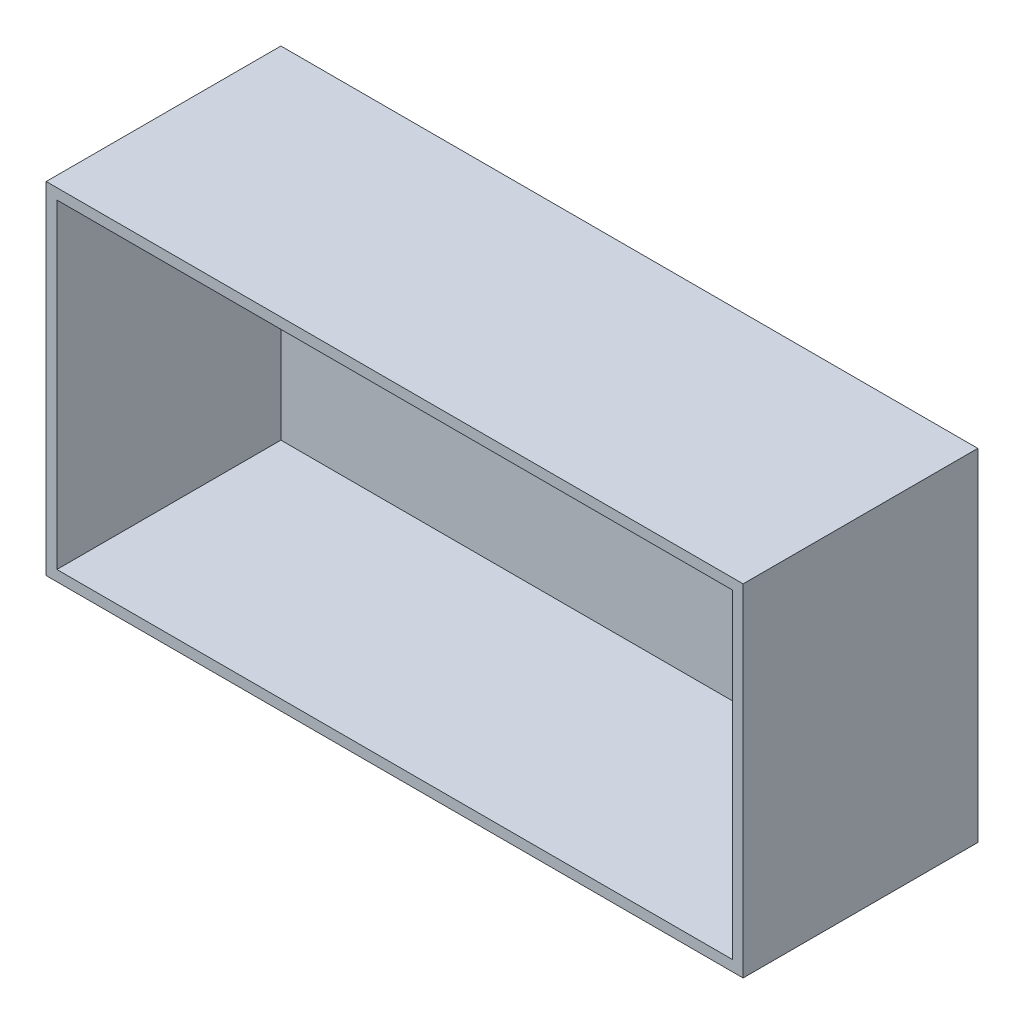
ISO-10303-21;
HEADER;
FILE_DESCRIPTION(('STEP AP214'),'2;1');
FILE_NAME('part.step','',(''),(''),'','','');
FILE_SCHEMA(('AUTOMOTIVE_DESIGN { 1 0 10303 214 1 1 1 1 }'));
ENDSEC;
DATA;
#1=APPLICATION_CONTEXT('core data for automotive mechanical design processes');
#2=APPLICATION_PROTOCOL_DEFINITION('international standard','automotive_design',2000,#1);
#3=PRODUCT_CONTEXT('',#1,'mechanical');
#4=PRODUCT('Part','Part','',(#3));
#5=PRODUCT_RELATED_PRODUCT_CATEGORY('part','',(#4));
#6=PRODUCT_DEFINITION_FORMATION('','',#4);
#7=PRODUCT_DEFINITION_CONTEXT('part definition',#1,'design');
#8=PRODUCT_DEFINITION('design','',#6,#7);
#9=PRODUCT_DEFINITION_SHAPE('','',#8);
#10=(LENGTH_UNIT() NAMED_UNIT(*) SI_UNIT(.MILLI.,.METRE.));
#11=(NAMED_UNIT(*) PLANE_ANGLE_UNIT() SI_UNIT($,.RADIAN.));
#12=(NAMED_UNIT(*) SI_UNIT($,.STERADIAN.) SOLID_ANGLE_UNIT());
#13=UNCERTAINTY_MEASURE_WITH_UNIT(LENGTH_MEASURE(1.E-05),#10,'distance_accuracy_value','');
#14=(GEOMETRIC_REPRESENTATION_CONTEXT(3) GLOBAL_UNCERTAINTY_ASSIGNED_CONTEXT((#13)) GLOBAL_UNIT_ASSIGNED_CONTEXT((#10,
#11,#12)) REPRESENTATION_CONTEXT('',''));
#15=CARTESIAN_POINT('',(0.,0.,0.));
#16=DIRECTION('',(0.,0.,1.));
#17=DIRECTION('',(1.,0.,0.));
#18=AXIS2_PLACEMENT_3D('',#15,#16,#17);
#19=CARTESIAN_POINT('',(0.,0.,66.));
#20=DIRECTION('',(0.,0.,-1.));
#21=DIRECTION('',(-1.,0.,0.));
#22=AXIS2_PLACEMENT_3D('',#19,#20,#21);
#23=PLANE('',#22);
#24=DIRECTION('',(0.,-1.,0.));
#25=VECTOR('',#24,1.);
#26=CARTESIAN_POINT('',(0.,0.,66.));
#27=LINE('',#26,#25);
#28=CARTESIAN_POINT('',(0.,96.,66.));
#29=VERTEX_POINT('',#28);
#30=CARTESIAN_POINT('',(0.,0.,66.));
#31=VERTEX_POINT('',#30);
#32=EDGE_CURVE('E141',#29,#31,#27,.T.);
#33=ORIENTED_EDGE('',*,*,#32,.T.);
#34=DIRECTION('',(1.,0.,0.));
#35=VECTOR('',#34,1.);
#36=CARTESIAN_POINT('',(0.,0.,66.));
#37=LINE('',#36,#35);
#38=CARTESIAN_POINT('',(196.,0.,66.));
#39=VERTEX_POINT('',#38);
#40=EDGE_CURVE('E143',#31,#39,#37,.T.);
#41=ORIENTED_EDGE('',*,*,#40,.T.);
#42=DIRECTION('',(0.,1.,0.));
#43=VECTOR('',#42,1.);
#44=CARTESIAN_POINT('',(196.,0.,66.));
#45=LINE('',#44,#43);
#46=CARTESIAN_POINT('',(196.,96.,66.));
#47=VERTEX_POINT('',#46);
#48=EDGE_CURVE('E150',#39,#47,#45,.T.);
#49=ORIENTED_EDGE('',*,*,#48,.T.);
#50=DIRECTION('',(-1.,0.,0.));
#51=VECTOR('',#50,1.);
#52=CARTESIAN_POINT('',(0.,96.,66.));
#53=LINE('',#52,#51);
#54=EDGE_CURVE('E146',#47,#29,#53,.T.);
#55=ORIENTED_EDGE('',*,*,#54,.T.);
#56=EDGE_LOOP('',(#33,#41,#49,#55));
#57=FACE_BOUND('',#56,.T.);
#58=DIRECTION('',(0.,-1.,0.));
#59=VECTOR('',#58,1.);
#60=CARTESIAN_POINT('',(3.,3.,66.));
#61=LINE('',#60,#59);
#62=CARTESIAN_POINT('',(3.,93.,66.));
#63=VERTEX_POINT('',#62);
#64=CARTESIAN_POINT('',(3.,3.,66.));
#65=VERTEX_POINT('',#64);
#66=EDGE_CURVE('E125',#63,#65,#61,.T.);
#67=ORIENTED_EDGE('',*,*,#66,.F.);
#68=DIRECTION('',(-1.,0.,0.));
#69=VECTOR('',#68,1.);
#70=CARTESIAN_POINT('',(3.,93.,66.));
#71=LINE('',#70,#69);
#72=CARTESIAN_POINT('',(193.,93.,66.));
#73=VERTEX_POINT('',#72);
#74=EDGE_CURVE('E115',#73,#63,#71,.T.);
#75=ORIENTED_EDGE('',*,*,#74,.F.);
#76=DIRECTION('',(0.,1.,0.));
#77=VECTOR('',#76,1.);
#78=CARTESIAN_POINT('',(193.,3.,66.));
#79=LINE('',#78,#77);
#80=CARTESIAN_POINT('',(193.,3.,66.));
#81=VERTEX_POINT('',#80);
#82=EDGE_CURVE('E135',#81,#73,#79,.T.);
#83=ORIENTED_EDGE('',*,*,#82,.F.);
#84=DIRECTION('',(1.,0.,0.));
#85=VECTOR('',#84,1.);
#86=CARTESIAN_POINT('',(3.,3.,66.));
#87=LINE('',#86,#85);
#88=EDGE_CURVE('E128',#65,#81,#87,.T.);
#89=ORIENTED_EDGE('',*,*,#88,.F.);
#90=EDGE_LOOP('',(#67,#75,#83,#89));
#91=FACE_BOUND('',#90,.T.);
#92=ADVANCED_FACE('F39',(#57,#91),#23,.F.);
#93=CARTESIAN_POINT('',(0.,0.,0.));
#94=DIRECTION('',(0.,0.,-1.));
#95=DIRECTION('',(-1.,0.,0.));
#96=AXIS2_PLACEMENT_3D('',#93,#94,#95);
#97=PLANE('',#96);
#98=DIRECTION('',(0.,-1.,0.));
#99=VECTOR('',#98,1.);
#100=CARTESIAN_POINT('',(0.,0.,0.));
#101=LINE('',#100,#99);
#102=CARTESIAN_POINT('',(0.,96.,0.));
#103=VERTEX_POINT('',#102);
#104=CARTESIAN_POINT('',(0.,0.,0.));
#105=VERTEX_POINT('',#104);
#106=EDGE_CURVE('E139',#103,#105,#101,.T.);
#107=ORIENTED_EDGE('',*,*,#106,.F.);
#108=DIRECTION('',(-1.,0.,0.));
#109=VECTOR('',#108,1.);
#110=CARTESIAN_POINT('',(0.,96.,0.));
#111=LINE('',#110,#109);
#112=CARTESIAN_POINT('',(196.,96.,0.));
#113=VERTEX_POINT('',#112);
#114=EDGE_CURVE('E144',#113,#103,#111,.T.);
#115=ORIENTED_EDGE('',*,*,#114,.F.);
#116=DIRECTION('',(0.,1.,0.));
#117=VECTOR('',#116,1.);
#118=CARTESIAN_POINT('',(196.,0.,0.));
#119=LINE('',#118,#117);
#120=CARTESIAN_POINT('',(196.,0.,0.));
#121=VERTEX_POINT('',#120);
#122=EDGE_CURVE('E157',#121,#113,#119,.T.);
#123=ORIENTED_EDGE('',*,*,#122,.F.);
#124=DIRECTION('',(1.,0.,0.));
#125=VECTOR('',#124,1.);
#126=CARTESIAN_POINT('',(0.,0.,0.));
#127=LINE('',#126,#125);
#128=EDGE_CURVE('E152',#105,#121,#127,.T.);
#129=ORIENTED_EDGE('',*,*,#128,.F.);
#130=EDGE_LOOP('',(#107,#115,#123,#129));
#131=FACE_BOUND('',#130,.T.);
#132=ADVANCED_FACE('F174',(#131),#97,.T.);
#133=CARTESIAN_POINT('',(0.,0.,66.));
#134=DIRECTION('',(1.,0.,0.));
#135=DIRECTION('',(0.,0.,-1.));
#136=AXIS2_PLACEMENT_3D('',#133,#134,#135);
#137=PLANE('',#136);
#138=ORIENTED_EDGE('',*,*,#106,.T.);
#139=DIRECTION('',(0.,0.,-1.));
#140=VECTOR('',#139,1.);
#141=CARTESIAN_POINT('',(0.,0.,66.));
#142=LINE('',#141,#140);
#143=EDGE_CURVE('E11',#31,#105,#142,.T.);
#144=ORIENTED_EDGE('',*,*,#143,.F.);
#145=ORIENTED_EDGE('',*,*,#32,.F.);
#146=DIRECTION('',(0.,0.,-1.));
#147=VECTOR('',#146,1.);
#148=CARTESIAN_POINT('',(0.,96.,66.));
#149=LINE('',#148,#147);
#150=EDGE_CURVE('E153',#29,#103,#149,.T.);
#151=ORIENTED_EDGE('',*,*,#150,.T.);
#152=EDGE_LOOP('',(#138,#144,#145,#151));
#153=FACE_BOUND('',#152,.T.);
#154=ADVANCED_FACE('F41',(#153),#137,.F.);
#155=CARTESIAN_POINT('',(0.,0.,66.));
#156=DIRECTION('',(0.,1.,0.));
#157=DIRECTION('',(0.,0.,1.));
#158=AXIS2_PLACEMENT_3D('',#155,#156,#157);
#159=PLANE('',#158);
#160=ORIENTED_EDGE('',*,*,#128,.T.);
#161=DIRECTION('',(0.,0.,-1.));
#162=VECTOR('',#161,1.);
#163=CARTESIAN_POINT('',(196.,0.,66.));
#164=LINE('',#163,#162);
#165=EDGE_CURVE('E50',#39,#121,#164,.T.);
#166=ORIENTED_EDGE('',*,*,#165,.F.);
#167=ORIENTED_EDGE('',*,*,#40,.F.);
#168=ORIENTED_EDGE('',*,*,#143,.T.);
#169=EDGE_LOOP('',(#160,#166,#167,#168));
#170=FACE_BOUND('',#169,.T.);
#171=ADVANCED_FACE('F182',(#170),#159,.F.);
#172=CARTESIAN_POINT('',(196.,0.,66.));
#173=DIRECTION('',(-1.,0.,0.));
#174=DIRECTION('',(0.,0.,1.));
#175=AXIS2_PLACEMENT_3D('',#172,#173,#174);
#176=PLANE('',#175);
#177=ORIENTED_EDGE('',*,*,#122,.T.);
#178=DIRECTION('',(0.,0.,-1.));
#179=VECTOR('',#178,1.);
#180=CARTESIAN_POINT('',(196.,96.,66.));
#181=LINE('',#180,#179);
#182=EDGE_CURVE('E163',#47,#113,#181,.T.);
#183=ORIENTED_EDGE('',*,*,#182,.F.);
#184=ORIENTED_EDGE('',*,*,#48,.F.);
#185=ORIENTED_EDGE('',*,*,#165,.T.);
#186=EDGE_LOOP('',(#177,#183,#184,#185));
#187=FACE_BOUND('',#186,.T.);
#188=ADVANCED_FACE('F166',(#187),#176,.F.);
#189=CARTESIAN_POINT('',(0.,96.,66.));
#190=DIRECTION('',(0.,-1.,0.));
#191=DIRECTION('',(0.,0.,-1.));
#192=AXIS2_PLACEMENT_3D('',#189,#190,#191);
#193=PLANE('',#192);
#194=ORIENTED_EDGE('',*,*,#114,.T.);
#195=ORIENTED_EDGE('',*,*,#150,.F.);
#196=ORIENTED_EDGE('',*,*,#54,.F.);
#197=ORIENTED_EDGE('',*,*,#182,.T.);
#198=EDGE_LOOP('',(#194,#195,#196,#197));
#199=FACE_BOUND('',#198,.T.);
#200=ADVANCED_FACE('F180',(#199),#193,.F.);
#201=CARTESIAN_POINT('',(3.,3.,66.));
#202=DIRECTION('',(1.,0.,0.));
#203=DIRECTION('',(0.,0.,-1.));
#204=AXIS2_PLACEMENT_3D('',#201,#202,#203);
#205=PLANE('',#204);
#206=DIRECTION('',(0.,-1.,0.));
#207=VECTOR('',#206,1.);
#208=CARTESIAN_POINT('',(3.,3.,3.));
#209=LINE('',#208,#207);
#210=CARTESIAN_POINT('',(3.,93.,3.));
#211=VERTEX_POINT('',#210);
#212=CARTESIAN_POINT('',(3.,3.,3.));
#213=VERTEX_POINT('',#212);
#214=EDGE_CURVE('E116',#211,#213,#209,.T.);
#215=ORIENTED_EDGE('',*,*,#214,.F.);
#216=DIRECTION('',(0.,0.,-1.));
#217=VECTOR('',#216,1.);
#218=CARTESIAN_POINT('',(3.,93.,66.));
#219=LINE('',#218,#217);
#220=EDGE_CURVE('E108',#63,#211,#219,.T.);
#221=ORIENTED_EDGE('',*,*,#220,.F.);
#222=ORIENTED_EDGE('',*,*,#66,.T.);
#223=DIRECTION('',(0.,0.,-1.));
#224=VECTOR('',#223,1.);
#225=CARTESIAN_POINT('',(3.,3.,66.));
#226=LINE('',#225,#224);
#227=EDGE_CURVE('E119',#65,#213,#226,.T.);
#228=ORIENTED_EDGE('',*,*,#227,.T.);
#229=EDGE_LOOP('',(#215,#221,#222,#228));
#230=FACE_BOUND('',#229,.T.);
#231=ADVANCED_FACE('F117',(#230),#205,.T.);
#232=CARTESIAN_POINT('',(3.,3.,66.));
#233=DIRECTION('',(0.,1.,0.));
#234=DIRECTION('',(0.,0.,1.));
#235=AXIS2_PLACEMENT_3D('',#232,#233,#234);
#236=PLANE('',#235);
#237=DIRECTION('',(1.,0.,0.));
#238=VECTOR('',#237,1.);
#239=CARTESIAN_POINT('',(3.,3.,3.));
#240=LINE('',#239,#238);
#241=CARTESIAN_POINT('',(193.,3.,3.));
#242=VERTEX_POINT('',#241);
#243=EDGE_CURVE('E53',#213,#242,#240,.T.);
#244=ORIENTED_EDGE('',*,*,#243,.F.);
#245=ORIENTED_EDGE('',*,*,#227,.F.);
#246=ORIENTED_EDGE('',*,*,#88,.T.);
#247=DIRECTION('',(0.,0.,-1.));
#248=VECTOR('',#247,1.);
#249=CARTESIAN_POINT('',(193.,3.,66.));
#250=LINE('',#249,#248);
#251=EDGE_CURVE('E140',#81,#242,#250,.T.);
#252=ORIENTED_EDGE('',*,*,#251,.T.);
#253=EDGE_LOOP('',(#244,#245,#246,#252));
#254=FACE_BOUND('',#253,.T.);
#255=ADVANCED_FACE('F204',(#254),#236,.T.);
#256=CARTESIAN_POINT('',(193.,3.,66.));
#257=DIRECTION('',(-1.,0.,0.));
#258=DIRECTION('',(0.,0.,1.));
#259=AXIS2_PLACEMENT_3D('',#256,#257,#258);
#260=PLANE('',#259);
#261=DIRECTION('',(0.,1.,0.));
#262=VECTOR('',#261,1.);
#263=CARTESIAN_POINT('',(193.,3.,3.));
#264=LINE('',#263,#262);
#265=CARTESIAN_POINT('',(193.,93.,3.));
#266=VERTEX_POINT('',#265);
#267=EDGE_CURVE('E65',#242,#266,#264,.T.);
#268=ORIENTED_EDGE('',*,*,#267,.F.);
#269=ORIENTED_EDGE('',*,*,#251,.F.);
#270=ORIENTED_EDGE('',*,*,#82,.T.);
#271=DIRECTION('',(0.,0.,-1.));
#272=VECTOR('',#271,1.);
#273=CARTESIAN_POINT('',(193.,93.,66.));
#274=LINE('',#273,#272);
#275=EDGE_CURVE('E113',#73,#266,#274,.T.);
#276=ORIENTED_EDGE('',*,*,#275,.T.);
#277=EDGE_LOOP('',(#268,#269,#270,#276));
#278=FACE_BOUND('',#277,.T.);
#279=ADVANCED_FACE('F206',(#278),#260,.T.);
#280=CARTESIAN_POINT('',(3.,93.,66.));
#281=DIRECTION('',(0.,-1.,0.));
#282=DIRECTION('',(0.,0.,-1.));
#283=AXIS2_PLACEMENT_3D('',#280,#281,#282);
#284=PLANE('',#283);
#285=DIRECTION('',(-1.,0.,0.));
#286=VECTOR('',#285,1.);
#287=CARTESIAN_POINT('',(3.,93.,3.));
#288=LINE('',#287,#286);
#289=EDGE_CURVE('E109',#266,#211,#288,.T.);
#290=ORIENTED_EDGE('',*,*,#289,.F.);
#291=ORIENTED_EDGE('',*,*,#275,.F.);
#292=ORIENTED_EDGE('',*,*,#74,.T.);
#293=ORIENTED_EDGE('',*,*,#220,.T.);
#294=EDGE_LOOP('',(#290,#291,#292,#293));
#295=FACE_BOUND('',#294,.T.);
#296=ADVANCED_FACE('F106',(#295),#284,.T.);
#297=CARTESIAN_POINT('',(0.,0.,3.));
#298=DIRECTION('',(0.,0.,-1.));
#299=DIRECTION('',(-1.,0.,0.));
#300=AXIS2_PLACEMENT_3D('',#297,#298,#299);
#301=PLANE('',#300);
#302=ORIENTED_EDGE('',*,*,#214,.T.);
#303=ORIENTED_EDGE('',*,*,#243,.T.);
#304=ORIENTED_EDGE('',*,*,#267,.T.);
#305=ORIENTED_EDGE('',*,*,#289,.T.);
#306=EDGE_LOOP('',(#302,#303,#304,#305));
#307=FACE_BOUND('',#306,.T.);
#308=ADVANCED_FACE('F121',(#307),#301,.F.);
#309=CLOSED_SHELL('',(#92,#132,#154,#171,#188,#200,#231,#255,#279,#296,#308));
#310=MANIFOLD_SOLID_BREP('B2',#309);
#311=ADVANCED_BREP_SHAPE_REPRESENTATION('',(#18,#310),#14);
#312=SHAPE_DEFINITION_REPRESENTATION(#9,#311);
ENDSEC;
END-ISO-10303-21;
